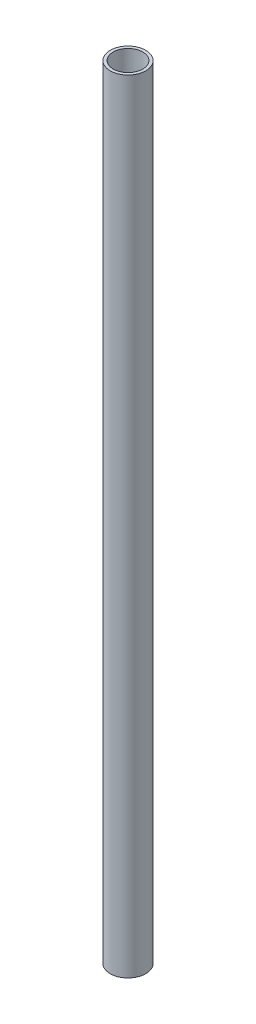
ISO-10303-21;
HEADER;
FILE_DESCRIPTION(('STEP AP214'),'2;1');
FILE_NAME('part.step','',(''),(''),'','','');
FILE_SCHEMA(('AUTOMOTIVE_DESIGN { 1 0 10303 214 1 1 1 1 }'));
ENDSEC;
DATA;
#1=APPLICATION_CONTEXT('core data for automotive mechanical design processes');
#2=APPLICATION_PROTOCOL_DEFINITION('international standard','automotive_design',2000,#1);
#3=PRODUCT_CONTEXT('',#1,'mechanical');
#4=PRODUCT('Part','Part','',(#3));
#5=PRODUCT_RELATED_PRODUCT_CATEGORY('part','',(#4));
#6=PRODUCT_DEFINITION_FORMATION('','',#4);
#7=PRODUCT_DEFINITION_CONTEXT('part definition',#1,'design');
#8=PRODUCT_DEFINITION('design','',#6,#7);
#9=PRODUCT_DEFINITION_SHAPE('','',#8);
#10=(LENGTH_UNIT() NAMED_UNIT(*) SI_UNIT(.MILLI.,.METRE.));
#11=(NAMED_UNIT(*) PLANE_ANGLE_UNIT() SI_UNIT($,.RADIAN.));
#12=(NAMED_UNIT(*) SI_UNIT($,.STERADIAN.) SOLID_ANGLE_UNIT());
#13=UNCERTAINTY_MEASURE_WITH_UNIT(LENGTH_MEASURE(1.E-05),#10,'distance_accuracy_value','');
#14=(GEOMETRIC_REPRESENTATION_CONTEXT(3) GLOBAL_UNCERTAINTY_ASSIGNED_CONTEXT((#13)) GLOBAL_UNIT_ASSIGNED_CONTEXT((#10,
#11,#12)) REPRESENTATION_CONTEXT('',''));
#15=CARTESIAN_POINT('',(0.,0.,0.));
#16=DIRECTION('',(0.,0.,1.));
#17=DIRECTION('',(1.,0.,0.));
#18=AXIS2_PLACEMENT_3D('',#15,#16,#17);
#19=CARTESIAN_POINT('',(0.,927.1,0.));
#20=DIRECTION('',(0.,1.,0.));
#21=DIRECTION('',(0.,0.,1.));
#22=AXIS2_PLACEMENT_3D('',#19,#20,#21);
#23=PLANE('',#22);
#24=CARTESIAN_POINT('',(0.,927.1,0.));
#25=DIRECTION('',(0.,1.,0.));
#26=DIRECTION('',(0.,0.,1.));
#27=AXIS2_PLACEMENT_3D('',#24,#25,#26);
#28=CIRCLE('',#27,21.082);
#29=CARTESIAN_POINT('',(0.,927.1,21.082));
#30=VERTEX_POINT('',#29);
#31=EDGE_CURVE('E10',#30,#30,#28,.T.);
#32=ORIENTED_EDGE('',*,*,#31,.T.);
#33=EDGE_LOOP('',(#32));
#34=FACE_BOUND('',#33,.T.);
#35=CARTESIAN_POINT('',(0.,927.1,0.));
#36=DIRECTION('',(0.,1.,0.));
#37=DIRECTION('',(0.,0.,1.));
#38=AXIS2_PLACEMENT_3D('',#35,#36,#37);
#39=CIRCLE('',#38,17.526);
#40=CARTESIAN_POINT('',(0.,927.1,17.526));
#41=VERTEX_POINT('',#40);
#42=EDGE_CURVE('E47',#41,#41,#39,.T.);
#43=ORIENTED_EDGE('',*,*,#42,.F.);
#44=EDGE_LOOP('',(#43));
#45=FACE_BOUND('',#44,.T.);
#46=ADVANCED_FACE('F33',(#34,#45),#23,.T.);
#47=CARTESIAN_POINT('',(0.,0.,0.));
#48=DIRECTION('',(0.,1.,0.));
#49=DIRECTION('',(0.,0.,1.));
#50=AXIS2_PLACEMENT_3D('',#47,#48,#49);
#51=PLANE('',#50);
#52=CARTESIAN_POINT('',(0.,0.,0.));
#53=DIRECTION('',(0.,1.,0.));
#54=DIRECTION('',(0.,0.,1.));
#55=AXIS2_PLACEMENT_3D('',#52,#53,#54);
#56=CIRCLE('',#55,21.082);
#57=CARTESIAN_POINT('',(0.,0.,21.082));
#58=VERTEX_POINT('',#57);
#59=EDGE_CURVE('E37',#58,#58,#56,.T.);
#60=ORIENTED_EDGE('',*,*,#59,.F.);
#61=EDGE_LOOP('',(#60));
#62=FACE_BOUND('',#61,.T.);
#63=CARTESIAN_POINT('',(0.,0.,0.));
#64=DIRECTION('',(0.,1.,0.));
#65=DIRECTION('',(0.,0.,1.));
#66=AXIS2_PLACEMENT_3D('',#63,#64,#65);
#67=CIRCLE('',#66,17.526);
#68=CARTESIAN_POINT('',(0.,0.,17.526));
#69=VERTEX_POINT('',#68);
#70=EDGE_CURVE('E49',#69,#69,#67,.T.);
#71=ORIENTED_EDGE('',*,*,#70,.T.);
#72=EDGE_LOOP('',(#71));
#73=FACE_BOUND('',#72,.T.);
#74=ADVANCED_FACE('F62',(#62,#73),#51,.F.);
#75=CARTESIAN_POINT('',(0.,927.1,0.));
#76=DIRECTION('',(0.,-1.,0.));
#77=DIRECTION('',(0.,0.,-1.));
#78=AXIS2_PLACEMENT_3D('',#75,#76,#77);
#79=CYLINDRICAL_SURFACE('',#78,21.082);
#80=ORIENTED_EDGE('',*,*,#31,.F.);
#81=EDGE_LOOP('',(#80));
#82=FACE_BOUND('',#81,.T.);
#83=ORIENTED_EDGE('',*,*,#59,.T.);
#84=EDGE_LOOP('',(#83));
#85=FACE_BOUND('',#84,.T.);
#86=ADVANCED_FACE('F35',(#82,#85),#79,.T.);
#87=CARTESIAN_POINT('',(0.,927.1,0.));
#88=DIRECTION('',(0.,-1.,0.));
#89=DIRECTION('',(0.,0.,-1.));
#90=AXIS2_PLACEMENT_3D('',#87,#88,#89);
#91=CYLINDRICAL_SURFACE('',#90,17.526);
#92=ORIENTED_EDGE('',*,*,#42,.T.);
#93=EDGE_LOOP('',(#92));
#94=FACE_BOUND('',#93,.T.);
#95=ORIENTED_EDGE('',*,*,#70,.F.);
#96=EDGE_LOOP('',(#95));
#97=FACE_BOUND('',#96,.T.);
#98=ADVANCED_FACE('F58',(#94,#97),#91,.F.);
#99=CLOSED_SHELL('',(#46,#74,#86,#98));
#100=MANIFOLD_SOLID_BREP('B2',#99);
#101=ADVANCED_BREP_SHAPE_REPRESENTATION('',(#18,#100),#14);
#102=SHAPE_DEFINITION_REPRESENTATION(#9,#101);
ENDSEC;
END-ISO-10303-21;
